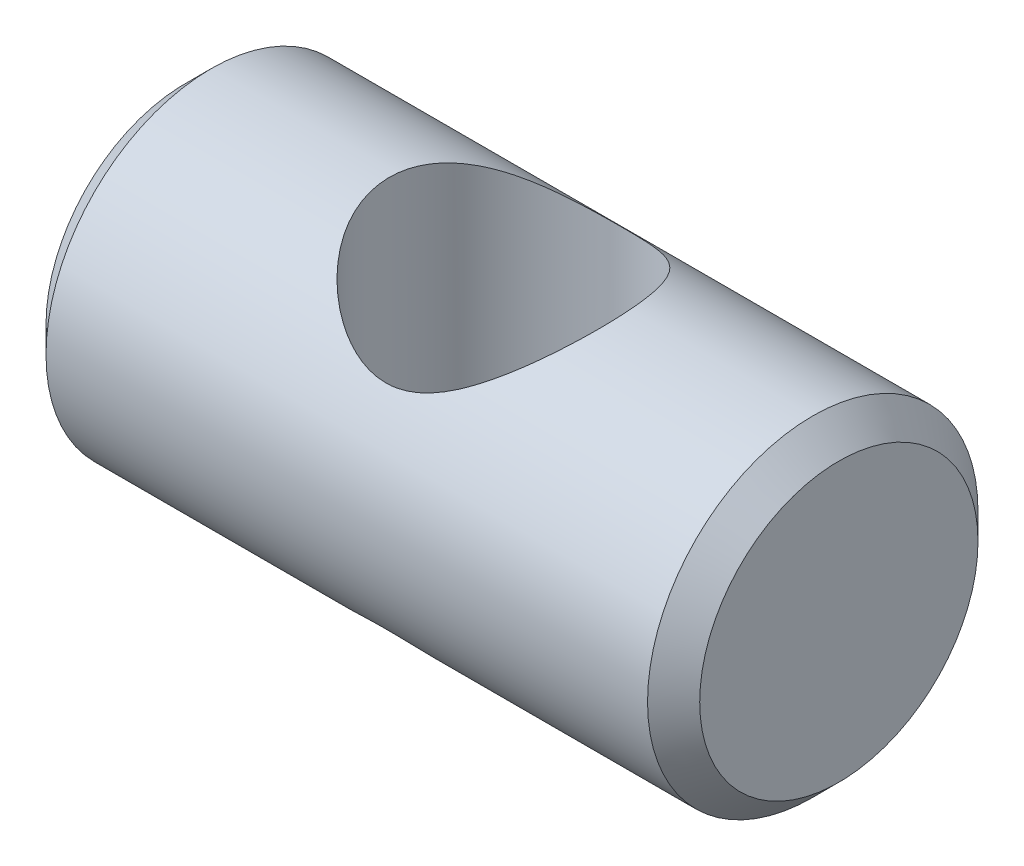
ISO-10303-21;
HEADER;
FILE_DESCRIPTION(('STEP AP214'),'2;1');
FILE_NAME('part.step','',(''),(''),'','','');
FILE_SCHEMA(('AUTOMOTIVE_DESIGN { 1 0 10303 214 1 1 1 1 }'));
ENDSEC;
DATA;
#1=APPLICATION_CONTEXT('core data for automotive mechanical design processes');
#2=APPLICATION_PROTOCOL_DEFINITION('international standard','automotive_design',2000,#1);
#3=PRODUCT_CONTEXT('',#1,'mechanical');
#4=PRODUCT('Part','Part','',(#3));
#5=PRODUCT_RELATED_PRODUCT_CATEGORY('part','',(#4));
#6=PRODUCT_DEFINITION_FORMATION('','',#4);
#7=PRODUCT_DEFINITION_CONTEXT('part definition',#1,'design');
#8=PRODUCT_DEFINITION('design','',#6,#7);
#9=PRODUCT_DEFINITION_SHAPE('','',#8);
#10=(LENGTH_UNIT() NAMED_UNIT(*) SI_UNIT(.MILLI.,.METRE.));
#11=(NAMED_UNIT(*) PLANE_ANGLE_UNIT() SI_UNIT($,.RADIAN.));
#12=(NAMED_UNIT(*) SI_UNIT($,.STERADIAN.) SOLID_ANGLE_UNIT());
#13=UNCERTAINTY_MEASURE_WITH_UNIT(LENGTH_MEASURE(1.E-05),#10,'distance_accuracy_value','');
#14=(GEOMETRIC_REPRESENTATION_CONTEXT(3) GLOBAL_UNCERTAINTY_ASSIGNED_CONTEXT((#13)) GLOBAL_UNIT_ASSIGNED_CONTEXT((#10,
#11,#12)) REPRESENTATION_CONTEXT('',''));
#15=CARTESIAN_POINT('',(0.,0.,0.));
#16=DIRECTION('',(0.,0.,1.));
#17=DIRECTION('',(1.,0.,0.));
#18=AXIS2_PLACEMENT_3D('',#15,#16,#17);
#19=CARTESIAN_POINT('',(9.525,0.,0.));
#20=DIRECTION('',(-1.,0.,0.));
#21=DIRECTION('',(0.,0.,1.));
#22=AXIS2_PLACEMENT_3D('',#19,#20,#21);
#23=CYLINDRICAL_SURFACE('',#22,4.815);
#24=CARTESIAN_POINT('',(0.,-3.10512882180431,3.68));
#25=CARTESIAN_POINT('',(0.0789714187920897,-3.10512894479066,3.68000004118753));
#26=CARTESIAN_POINT('',(0.157946439078917,-3.10837877083629,3.67726507391647));
#27=CARTESIAN_POINT('',(0.31500795053879,-3.12117249122668,3.6664118724567));
#28=CARTESIAN_POINT('',(0.393094318409177,-3.13071724843311,3.65829290026836));
#29=CARTESIAN_POINT('',(0.54784296044505,-3.15557737703467,3.63686987112637));
#30=CARTESIAN_POINT('',(0.624500470742115,-3.17090933375467,3.62355090790435));
#31=CARTESIAN_POINT('',(0.775639525515809,-3.20655862900195,3.59204348170743));
#32=CARTESIAN_POINT('',(0.850119478255555,-3.22687951714205,3.57385155078471));
#33=CARTESIAN_POINT('',(1.09958772327644,-3.30313132389629,3.50411560556052));
#34=CARTESIAN_POINT('',(1.26865480972376,-3.36895862923184,3.44164123509058));
#35=CARTESIAN_POINT('',(1.50973650190857,-3.47712328927825,3.33114582233944));
#36=CARTESIAN_POINT('',(1.58808171227698,-3.5147906466302,3.29146922421573));
#37=CARTESIAN_POINT('',(1.74072455400558,-3.59225027633531,3.20675124939561));
#38=CARTESIAN_POINT('',(1.81502306053053,-3.6320420855258,3.16171103943426));
#39=CARTESIAN_POINT('',(2.03528798368164,-3.75510002022662,3.01657847411719));
#40=CARTESIAN_POINT('',(2.17484491937675,-3.84026404711248,2.90821958087041));
#41=CARTESIAN_POINT('',(2.43617398758568,-4.00891500688153,2.67096388383936));
#42=CARTESIAN_POINT('',(2.55795513348018,-4.09240277107728,2.542077558499));
#43=CARTESIAN_POINT('',(2.78285799296755,-4.25303421672009,2.26318862115322));
#44=CARTESIAN_POINT('',(2.8858213639269,-4.33012132767061,2.11302415131569));
#45=CARTESIAN_POINT('',(3.06846171341921,-4.47181097978333,1.79375045139742));
#46=CARTESIAN_POINT('',(3.14815906951766,-4.53642442911134,1.6246579801241));
#47=CARTESIAN_POINT('',(3.26979111757476,-4.63932955194135,1.29822969167341));
#48=CARTESIAN_POINT('',(3.31567716157499,-4.68015493762638,1.14317452528795));
#49=CARTESIAN_POINT('',(3.38536576293826,-4.74656623220698,0.825029749353608));
#50=CARTESIAN_POINT('',(3.40918321675744,-4.77216241673963,0.661945637822324));
#51=CARTESIAN_POINT('',(3.43303252536977,-4.80643730887566,0.331697917126471));
#52=CARTESIAN_POINT('',(3.43298552366586,-4.81505983538194,0.164522608482845));
#53=CARTESIAN_POINT('',(3.40851140444907,-4.81493952601391,-0.168030088722715));
#54=CARTESIAN_POINT('',(3.38408215105841,-4.80619516873944,-0.333407318490495));
#55=CARTESIAN_POINT('',(3.3138791037443,-4.77358584617663,-0.648815808680622));
#56=CARTESIAN_POINT('',(3.26927931152367,-4.75052947432999,-0.799198031305145));
#57=CARTESIAN_POINT('',(3.16107259585423,-4.69226263211895,-1.0903990801973));
#58=CARTESIAN_POINT('',(3.09746217235946,-4.65704992346689,-1.23121613955919));
#59=CARTESIAN_POINT('',(2.94708205133374,-4.5737541818996,-1.51274206938592));
#60=CARTESIAN_POINT('',(2.85877744951531,-4.52481711097353,-1.65237259571464));
#61=CARTESIAN_POINT('',(2.66469367017538,-4.41969566883284,-1.91590306528213));
#62=CARTESIAN_POINT('',(2.55889984492217,-4.36350523143258,-2.03978966737754));
#63=CARTESIAN_POINT('',(2.31257003542019,-4.23813733233648,-2.29023505508865));
#64=CARTESIAN_POINT('',(2.16918435449513,-4.16837079738491,-2.41370138327296));
#65=CARTESIAN_POINT('',(1.86320514841065,-4.03145779607654,-2.63602247417698));
#66=CARTESIAN_POINT('',(1.70060766023542,-3.96431187411382,-2.73487214585283));
#67=CARTESIAN_POINT('',(1.38424847883058,-3.85044076378346,-2.89245379760236));
#68=CARTESIAN_POINT('',(1.23296035036469,-3.80216309575032,-2.95501441252709));
#69=CARTESIAN_POINT('',(0.919526665527358,-3.71940953019862,-3.05854069394078));
#70=CARTESIAN_POINT('',(0.757399209115992,-3.68491126358804,-3.0995413947231));
#71=CARTESIAN_POINT('',(0.508142541523577,-3.64756595663523,-3.1432207653656));
#72=CARTESIAN_POINT('',(0.423564630431008,-3.6375030485773,-3.15482395388458));
#73=CARTESIAN_POINT('',(0.253328454883418,-3.62280047168622,-3.17169900926717));
#74=CARTESIAN_POINT('',(0.167670761945468,-3.6181580464019,-3.17697409416736));
#75=CARTESIAN_POINT('',(-0.00390180603948745,-3.61455687689245,-3.18107079700703));
#76=CARTESIAN_POINT('',(-0.0898166230568524,-3.61559693457329,-3.17989377530774));
#77=CARTESIAN_POINT('',(-0.261039688486609,-3.62328571232298,-3.17112803515628));
#78=CARTESIAN_POINT('',(-0.34634797204585,-3.62993410468953,-3.16353969132599));
#79=CARTESIAN_POINT('',(-0.575934317899943,-3.65514482139137,-3.13444870177027));
#80=CARTESIAN_POINT('',(-0.718937600084742,-3.67882007904235,-3.10688520612358));
#81=CARTESIAN_POINT('',(-0.9978570550132,-3.73848309928572,-3.03481760960614));
#82=CARTESIAN_POINT('',(-1.13376574782312,-3.77448356598434,-2.99029602397532));
#83=CARTESIAN_POINT('',(-1.44910598736589,-3.87087263892342,-2.86513656525369));
#84=CARTESIAN_POINT('',(-1.62441455540709,-3.93527056718094,-2.77717775727044));
#85=CARTESIAN_POINT('',(-1.95593535304292,-4.07083710772404,-2.57437715321706));
#86=CARTESIAN_POINT('',(-2.11211431423313,-4.14201714317586,-2.45948950807161));
#87=CARTESIAN_POINT('',(-2.40528638016312,-4.28394467520091,-2.20313545147889));
#88=CARTESIAN_POINT('',(-2.54200484788519,-4.3546746344452,-2.06134412356204));
#89=CARTESIAN_POINT('',(-2.79064947852197,-4.48726348886458,-1.75402355015986));
#90=CARTESIAN_POINT('',(-2.90261430808088,-4.54913616556973,-1.58853200184395));
#91=CARTESIAN_POINT('',(-3.08012786046204,-4.64744040772498,-1.26820760162608));
#92=CARTESIAN_POINT('',(-3.15040010863205,-4.68644477197368,-1.11678875814019));
#93=CARTESIAN_POINT('',(-3.2687717845267,-4.75032041684955,-0.802680662786113));
#94=CARTESIAN_POINT('',(-3.31688597839461,-4.77520111207927,-0.639998999872105));
#95=CARTESIAN_POINT('',(-3.38880805582435,-4.80814096894806,-0.306814037549411));
#96=CARTESIAN_POINT('',(-3.41250114048557,-4.81612086668262,-0.136277698150249));
#97=CARTESIAN_POINT('',(-3.4340092300131,-4.8136246814153,0.206282635332192));
#98=CARTESIAN_POINT('',(-3.43182921754347,-4.80315215232898,0.378306336601713));
#99=CARTESIAN_POINT('',(-3.40336427201724,-4.76576418306815,0.704702950560547));
#100=CARTESIAN_POINT('',(-3.37897503348185,-4.74019666689937,0.859405186635556));
#101=CARTESIAN_POINT('',(-3.31034325019996,-4.67540467950928,1.16132520010752));
#102=CARTESIAN_POINT('',(-3.2660953122134,-4.63617649896374,1.30854093221453));
#103=CARTESIAN_POINT('',(-3.15678277045815,-4.54374883680731,1.60108962395628));
#104=CARTESIAN_POINT('',(-3.09064357587423,-4.48986134139058,1.74579850532625));
#105=CARTESIAN_POINT('',(-2.94118013053975,-4.37256918310588,2.0217239174328));
#106=CARTESIAN_POINT('',(-2.85785423100748,-4.30916360729361,2.15293915186467));
#107=CARTESIAN_POINT('',(-2.66017567384967,-4.16432931191396,2.4228045788429));
#108=CARTESIAN_POINT('',(-2.54294298611071,-4.08169366098084,2.55868898833804));
#109=CARTESIAN_POINT('',(-2.28975461737093,-3.91289983657386,2.81005153492297));
#110=CARTESIAN_POINT('',(-2.15374806923598,-3.82673255605531,2.9254722164421));
#111=CARTESIAN_POINT('',(-1.92370651008769,-3.69213557107717,3.0917132566919));
#112=CARTESIAN_POINT('',(-1.83529894974849,-3.64270544248557,3.14962915106072));
#113=CARTESIAN_POINT('',(-1.65237774705944,-3.54644816113172,3.25763004987205));
#114=CARTESIAN_POINT('',(-1.55786156059638,-3.49962210821419,3.30771176145494));
#115=CARTESIAN_POINT('',(-1.36310343680935,-3.41068025432148,3.39934581090104));
#116=CARTESIAN_POINT('',(-1.26288295696372,-3.36854836320227,3.44092772010465));
#117=CARTESIAN_POINT('',(-1.05665007392314,-3.29114964876956,3.51502817363135));
#118=CARTESIAN_POINT('',(-0.950640805485819,-3.25587915615719,3.54755156625531));
#119=CARTESIAN_POINT('',(-0.707397457922107,-3.18765821819296,3.60911248697099));
#120=CARTESIAN_POINT('',(-0.568711754237502,-3.15723294230083,3.63550280754489));
#121=CARTESIAN_POINT('',(-0.357177885556252,-3.12625195678141,3.66209525150953));
#122=CARTESIAN_POINT('',(-0.286138537814919,-3.11836822880959,3.66879372211517));
#123=CARTESIAN_POINT('',(-0.143400287238082,-3.10780753135249,3.67774528718527));
#124=CARTESIAN_POINT('',(-0.0717016280873886,-3.10512871013959,3.67999996260403));
#125=CARTESIAN_POINT('',(0.,-3.10512882180431,3.68));
#126=B_SPLINE_CURVE_WITH_KNOTS('',3,(#24,#25,#26,#27,#28,#29,#30,#31,#32,#33,#34,#35,#36,#37,
#38,#39,#40,#41,#42,#43,#44,#45,#46,#47,#48,#49,#50,#51,#52,#53,#54,#55,#56,#57,#58,#59,#60,#61,
#62,#63,#64,#65,#66,#67,#68,#69,#70,#71,#72,#73,#74,#75,#76,#77,#78,#79,#80,#81,#82,#83,#84,#85,
#86,#87,#88,#89,#90,#91,#92,#93,#94,#95,#96,#97,#98,#99,#100,#101,#102,#103,#104,#105,#106,#107,
#108,#109,#110,#111,#112,#113,#114,#115,#116,#117,#118,#119,#120,#121,#122,#123,#124,#125),
.UNSPECIFIED.,.T.,.F.,(4,2,2,2,2,2,2,2,2,2,2,2,2,2,2,2,2,2,2,2,2,2,2,2,2,2,2,2,2,2,2,2,2,2,2,2,
2,2,2,2,2,2,2,2,2,2,2,2,2,2,4),(0.,0.236809152525774,0.47365077181234,0.711176364814413,
0.948871448986985,1.52076861321322,1.80728343041207,2.09373603610996,2.68010141782373,
3.26616843685786,3.85696018673272,4.44723292776895,4.94542809620055,5.4432867338245,
5.94279048096385,6.44233798831961,6.91595025354081,7.38964976925529,7.90462052604726,
8.42002479143251,9.0226076942837,9.62531511579272,10.1355260723198,10.6449053672248,
10.9024391927696,11.1598419988003,11.4171905361485,11.6745240373273,12.1151396526991,
12.556210803131,13.1722577794729,13.7893613565075,14.4144561213562,15.038567441891,
15.5507139731456,16.0625187139551,16.5767185263036,17.0908193152018,17.5647729755589,
18.038855430558,18.5409219629748,19.0430366828395,19.6336506247918,20.225897428955,
20.5755524380753,20.9253540213802,21.2739170947792,21.6222932501127,22.0531285440595,
22.2682145341611,22.4832239900099),.UNSPECIFIED.);
#127=CARTESIAN_POINT('',(0.,-3.10512882180431,3.68));
#128=VERTEX_POINT('',#127);
#129=EDGE_CURVE('E38',#128,#128,#126,.T.);
#130=ORIENTED_EDGE('',*,*,#129,.T.);
#131=EDGE_LOOP('',(#130));
#132=FACE_BOUND('',#131,.T.);
#133=CARTESIAN_POINT('',(0.,3.10512882180437,3.68));
#134=CARTESIAN_POINT('',(-0.0789714187920922,3.10512894479072,3.68000004118753));
#135=CARTESIAN_POINT('',(-0.157946439078922,3.10837877083631,3.67726507391647));
#136=CARTESIAN_POINT('',(-0.315007950538797,3.12117249122666,3.6664118724567));
#137=CARTESIAN_POINT('',(-0.393094318409184,3.1307172484331,3.65829290026836));
#138=CARTESIAN_POINT('',(-0.547842960445056,3.15557737703467,3.63686987112637));
#139=CARTESIAN_POINT('',(-0.62450047074212,3.17090933375467,3.62355090790435));
#140=CARTESIAN_POINT('',(-0.775639525515813,3.20655862900195,3.59204348170743));
#141=CARTESIAN_POINT('',(-0.850119478255558,3.22687951714205,3.57385155078471));
#142=CARTESIAN_POINT('',(-1.09958772327644,3.30313132389629,3.50411560556052));
#143=CARTESIAN_POINT('',(-1.26865480972376,3.36895862923184,3.44164123509058));
#144=CARTESIAN_POINT('',(-1.50973650190856,3.47712328927825,3.33114582233944));
#145=CARTESIAN_POINT('',(-1.58808171227698,3.5147906466302,3.29146922421573));
#146=CARTESIAN_POINT('',(-1.74072455400558,3.59225027633531,3.20675124939561));
#147=CARTESIAN_POINT('',(-1.81502306053053,3.6320420855258,3.16171103943426));
#148=CARTESIAN_POINT('',(-2.03528798368164,3.75510002022662,3.01657847411719));
#149=CARTESIAN_POINT('',(-2.17484491937675,3.84026404711248,2.90821958087041));
#150=CARTESIAN_POINT('',(-2.43617398758568,4.00891500688153,2.67096388383936));
#151=CARTESIAN_POINT('',(-2.55795513348018,4.09240277107728,2.542077558499));
#152=CARTESIAN_POINT('',(-2.78285799296755,4.25303421672009,2.26318862115322));
#153=CARTESIAN_POINT('',(-2.8858213639269,4.33012132767061,2.11302415131569));
#154=CARTESIAN_POINT('',(-3.06846171341921,4.47181097978333,1.79375045139742));
#155=CARTESIAN_POINT('',(-3.14815906951766,4.53642442911134,1.6246579801241));
#156=CARTESIAN_POINT('',(-3.26979111757476,4.63932955194135,1.29822969167341));
#157=CARTESIAN_POINT('',(-3.31567716157499,4.68015493762638,1.14317452528795));
#158=CARTESIAN_POINT('',(-3.38536576293826,4.74656623220698,0.825029749353607));
#159=CARTESIAN_POINT('',(-3.40918321675744,4.77216241673963,0.661945637822323));
#160=CARTESIAN_POINT('',(-3.43303252536977,4.80643730887566,0.331697917126471));
#161=CARTESIAN_POINT('',(-3.43298552366586,4.81505983538194,0.164522608482844));
#162=CARTESIAN_POINT('',(-3.40851140444907,4.81493952601391,-0.168030088722716));
#163=CARTESIAN_POINT('',(-3.38408215105841,4.80619516873944,-0.333407318490496));
#164=CARTESIAN_POINT('',(-3.3138791037443,4.77358584617663,-0.648815808680622));
#165=CARTESIAN_POINT('',(-3.26927931152367,4.75052947432999,-0.799198031305146));
#166=CARTESIAN_POINT('',(-3.16107259585423,4.69226263211895,-1.0903990801973));
#167=CARTESIAN_POINT('',(-3.09746217235946,4.65704992346689,-1.23121613955919));
#168=CARTESIAN_POINT('',(-2.94708205133374,4.5737541818996,-1.51274206938592));
#169=CARTESIAN_POINT('',(-2.85877744951531,4.52481711097353,-1.65237259571464));
#170=CARTESIAN_POINT('',(-2.66469367017538,4.41969566883284,-1.91590306528214));
#171=CARTESIAN_POINT('',(-2.55889984492217,4.36350523143258,-2.03978966737754));
#172=CARTESIAN_POINT('',(-2.31257003542019,4.23813733233648,-2.29023505508865));
#173=CARTESIAN_POINT('',(-2.16918435449513,4.16837079738491,-2.41370138327296));
#174=CARTESIAN_POINT('',(-1.86320514841065,4.03145779607654,-2.63602247417698));
#175=CARTESIAN_POINT('',(-1.70060766023542,3.96431187411382,-2.73487214585283));
#176=CARTESIAN_POINT('',(-1.38424847883058,3.85044076378346,-2.89245379760236));
#177=CARTESIAN_POINT('',(-1.23296035036469,3.80216309575032,-2.95501441252709));
#178=CARTESIAN_POINT('',(-0.919526665527357,3.71940953019862,-3.05854069394078));
#179=CARTESIAN_POINT('',(-0.757399209115991,3.68491126358804,-3.0995413947231));
#180=CARTESIAN_POINT('',(-0.508142541523576,3.64756595663523,-3.1432207653656));
#181=CARTESIAN_POINT('',(-0.423564630431008,3.6375030485773,-3.15482395388458));
#182=CARTESIAN_POINT('',(-0.253328454883418,3.62280047168622,-3.17169900926717));
#183=CARTESIAN_POINT('',(-0.167670761945467,3.6181580464019,-3.17697409416736));
#184=CARTESIAN_POINT('',(0.00390180603948782,3.61455687689245,-3.18107079700703));
#185=CARTESIAN_POINT('',(0.0898166230568528,3.61559693457329,-3.17989377530774));
#186=CARTESIAN_POINT('',(0.26103968848661,3.62328571232298,-3.17112803515628));
#187=CARTESIAN_POINT('',(0.34634797204585,3.62993410468953,-3.16353969132599));
#188=CARTESIAN_POINT('',(0.575934317899942,3.65514482139137,-3.13444870177027));
#189=CARTESIAN_POINT('',(0.718937600084742,3.67882007904235,-3.10688520612358));
#190=CARTESIAN_POINT('',(0.997857055013199,3.73848309928572,-3.03481760960614));
#191=CARTESIAN_POINT('',(1.13376574782312,3.77448356598434,-2.99029602397532));
#192=CARTESIAN_POINT('',(1.44910598736589,3.87087263892342,-2.86513656525369));
#193=CARTESIAN_POINT('',(1.62441455540709,3.93527056718094,-2.77717775727044));
#194=CARTESIAN_POINT('',(1.95593535304292,4.07083710772404,-2.57437715321706));
#195=CARTESIAN_POINT('',(2.11211431423313,4.14201714317586,-2.45948950807161));
#196=CARTESIAN_POINT('',(2.40528638016312,4.28394467520091,-2.20313545147889));
#197=CARTESIAN_POINT('',(2.54200484788519,4.3546746344452,-2.06134412356203));
#198=CARTESIAN_POINT('',(2.79064947852197,4.48726348886458,-1.75402355015986));
#199=CARTESIAN_POINT('',(2.90261430808089,4.54913616556974,-1.58853200184395));
#200=CARTESIAN_POINT('',(3.08012786046204,4.64744040772498,-1.26820760162608));
#201=CARTESIAN_POINT('',(3.15040010863205,4.68644477197368,-1.11678875814019));
#202=CARTESIAN_POINT('',(3.2687717845267,4.75032041684955,-0.802680662786112));
#203=CARTESIAN_POINT('',(3.31688597839461,4.77520111207928,-0.639998999872103));
#204=CARTESIAN_POINT('',(3.38880805582435,4.80814096894806,-0.306814037549409));
#205=CARTESIAN_POINT('',(3.41250114048557,4.81612086668262,-0.136277698150245));
#206=CARTESIAN_POINT('',(3.4340092300131,4.8136246814153,0.206282635332195));
#207=CARTESIAN_POINT('',(3.43182921754347,4.80315215232898,0.378306336601716));
#208=CARTESIAN_POINT('',(3.40336427201724,4.76576418306815,0.704702950560548));
#209=CARTESIAN_POINT('',(3.37897503348185,4.74019666689937,0.859405186635557));
#210=CARTESIAN_POINT('',(3.31034325019996,4.67540467950927,1.16132520010752));
#211=CARTESIAN_POINT('',(3.2660953122134,4.63617649896374,1.30854093221453));
#212=CARTESIAN_POINT('',(3.15678277045815,4.54374883680731,1.60108962395628));
#213=CARTESIAN_POINT('',(3.09064357587423,4.48986134139057,1.74579850532625));
#214=CARTESIAN_POINT('',(2.94118013053975,4.37256918310588,2.0217239174328));
#215=CARTESIAN_POINT('',(2.85785423100748,4.30916360729361,2.15293915186467));
#216=CARTESIAN_POINT('',(2.66017567384968,4.16432931191396,2.4228045788429));
#217=CARTESIAN_POINT('',(2.54294298611071,4.08169366098084,2.55868898833804));
#218=CARTESIAN_POINT('',(2.28975461737093,3.91289983657386,2.81005153492297));
#219=CARTESIAN_POINT('',(2.15374806923599,3.82673255605531,2.9254722164421));
#220=CARTESIAN_POINT('',(1.92370651008769,3.69213557107717,3.0917132566919));
#221=CARTESIAN_POINT('',(1.83529894974849,3.64270544248557,3.14962915106072));
#222=CARTESIAN_POINT('',(1.65237774705944,3.54644816113172,3.25763004987205));
#223=CARTESIAN_POINT('',(1.55786156059637,3.49962210821419,3.30771176145494));
#224=CARTESIAN_POINT('',(1.36310343680935,3.41068025432147,3.39934581090104));
#225=CARTESIAN_POINT('',(1.26288295696372,3.36854836320227,3.44092772010465));
#226=CARTESIAN_POINT('',(1.05665007392314,3.29114964876956,3.51502817363135));
#227=CARTESIAN_POINT('',(0.950640805485818,3.25587915615719,3.54755156625531));
#228=CARTESIAN_POINT('',(0.707397457922106,3.18765821819296,3.60911248697099));
#229=CARTESIAN_POINT('',(0.568711754237502,3.15723294230084,3.63550280754489));
#230=CARTESIAN_POINT('',(0.357177885556255,3.12625195678141,3.66209525150953));
#231=CARTESIAN_POINT('',(0.286138537814924,3.11836822880957,3.66879372211517));
#232=CARTESIAN_POINT('',(0.143400287238086,3.10780753135251,3.67774528718527));
#233=CARTESIAN_POINT('',(0.0717016280873905,3.10512871013964,3.67999996260403));
#234=CARTESIAN_POINT('',(0.,3.10512882180437,3.68));
#235=B_SPLINE_CURVE_WITH_KNOTS('',3,(#133,#134,#135,#136,#137,#138,#139,#140,#141,#142,#143,
#144,#145,#146,#147,#148,#149,#150,#151,#152,#153,#154,#155,#156,#157,#158,#159,#160,#161,#162,
#163,#164,#165,#166,#167,#168,#169,#170,#171,#172,#173,#174,#175,#176,#177,#178,#179,#180,#181,
#182,#183,#184,#185,#186,#187,#188,#189,#190,#191,#192,#193,#194,#195,#196,#197,#198,#199,#200,
#201,#202,#203,#204,#205,#206,#207,#208,#209,#210,#211,#212,#213,#214,#215,#216,#217,#218,#219,
#220,#221,#222,#223,#224,#225,#226,#227,#228,#229,#230,#231,#232,#233,#234),.UNSPECIFIED.,.T.,
.F.,(4,2,2,2,2,2,2,2,2,2,2,2,2,2,2,2,2,2,2,2,2,2,2,2,2,2,2,2,2,2,2,2,2,2,2,2,2,2,2,2,2,2,2,2,2,
2,2,2,2,2,4),(0.,0.236809152525779,0.473650771812345,0.711176364814416,0.948871448986985,
1.52076861321322,1.80728343041207,2.09373603610995,2.68010141782373,3.26616843685786,
3.85696018673272,4.44723292776894,4.94542809620055,5.44328673382449,5.94279048096385,
6.44233798831961,6.91595025354081,7.38964976925529,7.90462052604726,8.42002479143251,
9.02260769428369,9.62531511579272,10.1355260723198,10.6449053672248,10.9024391927696,
11.1598419988003,11.4171905361485,11.6745240373273,12.1151396526991,12.556210803131,
13.1722577794729,13.7893613565075,14.4144561213562,15.038567441891,15.5507139731456,
16.0625187139551,16.5767185263036,17.0908193152018,17.5647729755589,18.038855430558,
18.5409219629748,19.0430366828395,19.6336506247918,20.225897428955,20.5755524380753,
20.9253540213802,21.2739170947792,21.6222932501127,22.0531285440595,22.2682145341611,
22.4832239900099),.UNSPECIFIED.);
#236=CARTESIAN_POINT('',(0.,3.10512882180437,3.68));
#237=VERTEX_POINT('',#236);
#238=EDGE_CURVE('E55',#237,#237,#235,.T.);
#239=ORIENTED_EDGE('',*,*,#238,.T.);
#240=EDGE_LOOP('',(#239));
#241=FACE_BOUND('',#240,.T.);
#242=CARTESIAN_POINT('',(8.76500000000001,0.,0.));
#243=DIRECTION('',(1.,0.,0.));
#244=DIRECTION('',(0.,0.,-1.));
#245=AXIS2_PLACEMENT_3D('',#242,#243,#244);
#246=CIRCLE('',#245,4.815);
#247=CARTESIAN_POINT('',(8.76500000000001,0.,-4.815));
#248=VERTEX_POINT('',#247);
#249=EDGE_CURVE('E47',#248,#248,#246,.F.);
#250=ORIENTED_EDGE('',*,*,#249,.T.);
#251=EDGE_LOOP('',(#250));
#252=FACE_BOUND('',#251,.T.);
#253=CARTESIAN_POINT('',(-8.76499999999999,0.,0.));
#254=DIRECTION('',(1.,0.,0.));
#255=DIRECTION('',(0.,0.,-1.));
#256=AXIS2_PLACEMENT_3D('',#253,#254,#255);
#257=CIRCLE('',#256,4.815);
#258=CARTESIAN_POINT('',(-8.76499999999999,0.,-4.815));
#259=VERTEX_POINT('',#258);
#260=EDGE_CURVE('E52',#259,#259,#257,.T.);
#261=ORIENTED_EDGE('',*,*,#260,.T.);
#262=EDGE_LOOP('',(#261));
#263=FACE_BOUND('',#262,.T.);
#264=ADVANCED_FACE('F33',(#132,#241,#252,#263),#23,.T.);
#265=CARTESIAN_POINT('',(9.525,0.,0.));
#266=DIRECTION('',(1.,0.,0.));
#267=DIRECTION('',(0.,0.,-1.));
#268=AXIS2_PLACEMENT_3D('',#265,#266,#267);
#269=PLANE('',#268);
#270=CARTESIAN_POINT('',(9.525,0.,0.));
#271=DIRECTION('',(1.,0.,0.));
#272=DIRECTION('',(0.,0.,-1.));
#273=AXIS2_PLACEMENT_3D('',#270,#271,#272);
#274=CIRCLE('',#273,4.05500000000001);
#275=CARTESIAN_POINT('',(9.525,0.,-4.05500000000001));
#276=VERTEX_POINT('',#275);
#277=EDGE_CURVE('E92',#276,#276,#274,.T.);
#278=ORIENTED_EDGE('',*,*,#277,.T.);
#279=EDGE_LOOP('',(#278));
#280=FACE_BOUND('',#279,.T.);
#281=ADVANCED_FACE('F67',(#280),#269,.T.);
#282=CARTESIAN_POINT('',(-9.525,0.,0.));
#283=DIRECTION('',(1.,0.,0.));
#284=DIRECTION('',(0.,0.,-1.));
#285=AXIS2_PLACEMENT_3D('',#282,#283,#284);
#286=PLANE('',#285);
#287=CARTESIAN_POINT('',(-9.525,0.,0.));
#288=DIRECTION('',(1.,0.,0.));
#289=DIRECTION('',(0.,0.,-1.));
#290=AXIS2_PLACEMENT_3D('',#287,#288,#289);
#291=CIRCLE('',#290,4.05499999999998);
#292=CARTESIAN_POINT('',(-9.525,0.,-4.05499999999998));
#293=VERTEX_POINT('',#292);
#294=EDGE_CURVE('E10',#293,#293,#291,.F.);
#295=ORIENTED_EDGE('',*,*,#294,.T.);
#296=EDGE_LOOP('',(#295));
#297=FACE_BOUND('',#296,.T.);
#298=ADVANCED_FACE('F70',(#297),#286,.F.);
#299=CARTESIAN_POINT('',(9.525,0.,0.));
#300=DIRECTION('',(-1.,0.,0.));
#301=DIRECTION('',(0.,0.,1.));
#302=AXIS2_PLACEMENT_3D('',#299,#300,#301);
#303=CONICAL_SURFACE('',#302,4.05500000000001,0.785398163397447);
#304=ORIENTED_EDGE('',*,*,#249,.F.);
#305=EDGE_LOOP('',(#304));
#306=FACE_BOUND('',#305,.T.);
#307=ORIENTED_EDGE('',*,*,#277,.F.);
#308=EDGE_LOOP('',(#307));
#309=FACE_BOUND('',#308,.T.);
#310=ADVANCED_FACE('F73',(#306,#309),#303,.T.);
#311=CARTESIAN_POINT('',(-8.76499999999999,0.,0.));
#312=DIRECTION('',(1.,0.,0.));
#313=DIRECTION('',(0.,0.,-1.));
#314=AXIS2_PLACEMENT_3D('',#311,#312,#313);
#315=CONICAL_SURFACE('',#314,4.815,0.785398163397451);
#316=ORIENTED_EDGE('',*,*,#294,.F.);
#317=EDGE_LOOP('',(#316));
#318=FACE_BOUND('',#317,.T.);
#319=ORIENTED_EDGE('',*,*,#260,.F.);
#320=EDGE_LOOP('',(#319));
#321=FACE_BOUND('',#320,.T.);
#322=ADVANCED_FACE('F36',(#318,#321),#315,.T.);
#323=CARTESIAN_POINT('',(0.,-95.25,0.25));
#324=DIRECTION('',(0.,1.,0.));
#325=DIRECTION('',(0.,0.,1.));
#326=AXIS2_PLACEMENT_3D('',#323,#324,#325);
#327=CYLINDRICAL_SURFACE('',#326,3.43);
#328=ORIENTED_EDGE('',*,*,#238,.F.);
#329=EDGE_LOOP('',(#328));
#330=FACE_BOUND('',#329,.T.);
#331=ORIENTED_EDGE('',*,*,#129,.F.);
#332=EDGE_LOOP('',(#331));
#333=FACE_BOUND('',#332,.T.);
#334=ADVANCED_FACE('F62',(#330,#333),#327,.F.);
#335=CLOSED_SHELL('',(#264,#281,#298,#310,#322,#334));
#336=MANIFOLD_SOLID_BREP('B2',#335);
#337=ADVANCED_BREP_SHAPE_REPRESENTATION('',(#18,#336),#14);
#338=SHAPE_DEFINITION_REPRESENTATION(#9,#337);
ENDSEC;
END-ISO-10303-21;
